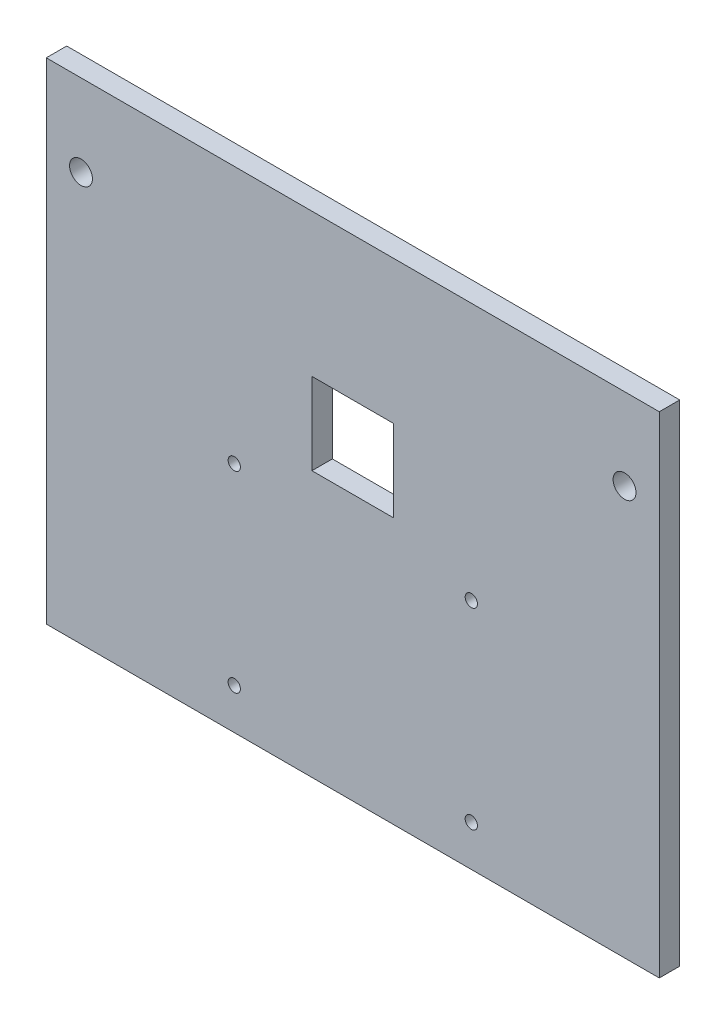
ISO-10303-21;
HEADER;
FILE_DESCRIPTION(('STEP AP214'),'2;1');
FILE_NAME('part.step','',(''),(''),'','','');
FILE_SCHEMA(('AUTOMOTIVE_DESIGN { 1 0 10303 214 1 1 1 1 }'));
ENDSEC;
DATA;
#1=APPLICATION_CONTEXT('core data for automotive mechanical design processes');
#2=APPLICATION_PROTOCOL_DEFINITION('international standard','automotive_design',2000,#1);
#3=PRODUCT_CONTEXT('',#1,'mechanical');
#4=PRODUCT('Part','Part','',(#3));
#5=PRODUCT_RELATED_PRODUCT_CATEGORY('part','',(#4));
#6=PRODUCT_DEFINITION_FORMATION('','',#4);
#7=PRODUCT_DEFINITION_CONTEXT('part definition',#1,'design');
#8=PRODUCT_DEFINITION('design','',#6,#7);
#9=PRODUCT_DEFINITION_SHAPE('','',#8);
#10=(LENGTH_UNIT() NAMED_UNIT(*) SI_UNIT(.MILLI.,.METRE.));
#11=(NAMED_UNIT(*) PLANE_ANGLE_UNIT() SI_UNIT($,.RADIAN.));
#12=(NAMED_UNIT(*) SI_UNIT($,.STERADIAN.) SOLID_ANGLE_UNIT());
#13=UNCERTAINTY_MEASURE_WITH_UNIT(LENGTH_MEASURE(1.E-05),#10,'distance_accuracy_value','');
#14=(GEOMETRIC_REPRESENTATION_CONTEXT(3) GLOBAL_UNCERTAINTY_ASSIGNED_CONTEXT((#13)) GLOBAL_UNIT_ASSIGNED_CONTEXT((#10,
#11,#12)) REPRESENTATION_CONTEXT('',''));
#15=CARTESIAN_POINT('',(0.,0.,0.));
#16=DIRECTION('',(0.,0.,1.));
#17=DIRECTION('',(1.,0.,0.));
#18=AXIS2_PLACEMENT_3D('',#15,#16,#17);
#19=CARTESIAN_POINT('',(0.,0.,5.));
#20=DIRECTION('',(0.,0.,1.));
#21=DIRECTION('',(1.,0.,0.));
#22=AXIS2_PLACEMENT_3D('',#19,#20,#21);
#23=PLANE('',#22);
#24=CARTESIAN_POINT('',(8.5,-20.,5.));
#25=DIRECTION('',(0.,0.,1.));
#26=DIRECTION('',(1.,0.,0.));
#27=AXIS2_PLACEMENT_3D('',#24,#25,#26);
#28=CIRCLE('',#27,2.8);
#29=CARTESIAN_POINT('',(11.3,-20.,5.));
#30=VERTEX_POINT('',#29);
#31=EDGE_CURVE('E285',#30,#30,#28,.T.);
#32=ORIENTED_EDGE('',*,*,#31,.F.);
#33=EDGE_LOOP('',(#32));
#34=FACE_BOUND('',#33,.T.);
#35=CARTESIAN_POINT('',(104.,-110.,5.));
#36=DIRECTION('',(0.,0.,1.));
#37=DIRECTION('',(1.,0.,0.));
#38=AXIS2_PLACEMENT_3D('',#35,#36,#37);
#39=CIRCLE('',#38,1.5);
#40=CARTESIAN_POINT('',(105.5,-110.,5.));
#41=VERTEX_POINT('',#40);
#42=EDGE_CURVE('E301',#41,#41,#39,.T.);
#43=ORIENTED_EDGE('',*,*,#42,.F.);
#44=EDGE_LOOP('',(#43));
#45=FACE_BOUND('',#44,.T.);
#46=CARTESIAN_POINT('',(46.,-63.,5.));
#47=DIRECTION('',(0.,0.,1.));
#48=DIRECTION('',(1.,0.,0.));
#49=AXIS2_PLACEMENT_3D('',#46,#47,#48);
#50=CIRCLE('',#49,1.5);
#51=CARTESIAN_POINT('',(47.5,-63.,5.));
#52=VERTEX_POINT('',#51);
#53=EDGE_CURVE('E140',#52,#52,#50,.T.);
#54=ORIENTED_EDGE('',*,*,#53,.F.);
#55=EDGE_LOOP('',(#54));
#56=FACE_BOUND('',#55,.T.);
#57=DIRECTION('',(0.,-1.,0.));
#58=VECTOR('',#57,1.);
#59=CARTESIAN_POINT('',(0.,0.,5.));
#60=LINE('',#59,#58);
#61=CARTESIAN_POINT('',(0.,0.,5.));
#62=VERTEX_POINT('',#61);
#63=CARTESIAN_POINT('',(0.,-120.,5.));
#64=VERTEX_POINT('',#63);
#65=EDGE_CURVE('E156',#62,#64,#60,.T.);
#66=ORIENTED_EDGE('',*,*,#65,.T.);
#67=DIRECTION('',(1.,0.,0.));
#68=VECTOR('',#67,1.);
#69=CARTESIAN_POINT('',(0.,-120.,5.));
#70=LINE('',#69,#68);
#71=CARTESIAN_POINT('',(150.,-120.,5.));
#72=VERTEX_POINT('',#71);
#73=EDGE_CURVE('E160',#64,#72,#70,.T.);
#74=ORIENTED_EDGE('',*,*,#73,.T.);
#75=DIRECTION('',(0.,1.,0.));
#76=VECTOR('',#75,1.);
#77=CARTESIAN_POINT('',(150.,0.,5.));
#78=LINE('',#77,#76);
#79=CARTESIAN_POINT('',(150.,0.,5.));
#80=VERTEX_POINT('',#79);
#81=EDGE_CURVE('E164',#72,#80,#78,.T.);
#82=ORIENTED_EDGE('',*,*,#81,.T.);
#83=DIRECTION('',(-1.,0.,0.));
#84=VECTOR('',#83,1.);
#85=CARTESIAN_POINT('',(0.,0.,5.));
#86=LINE('',#85,#84);
#87=EDGE_CURVE('E167',#80,#62,#86,.T.);
#88=ORIENTED_EDGE('',*,*,#87,.T.);
#89=EDGE_LOOP('',(#66,#74,#82,#88));
#90=FACE_BOUND('',#89,.T.);
#91=DIRECTION('',(1.,0.,0.));
#92=VECTOR('',#91,1.);
#93=CARTESIAN_POINT('',(65.,-55.,5.));
#94=LINE('',#93,#92);
#95=CARTESIAN_POINT('',(65.,-55.,5.));
#96=VERTEX_POINT('',#95);
#97=CARTESIAN_POINT('',(85.,-55.,5.));
#98=VERTEX_POINT('',#97);
#99=EDGE_CURVE('E114',#96,#98,#94,.T.);
#100=ORIENTED_EDGE('',*,*,#99,.F.);
#101=DIRECTION('',(0.,-1.,0.));
#102=VECTOR('',#101,1.);
#103=CARTESIAN_POINT('',(65.,-35.,5.));
#104=LINE('',#103,#102);
#105=CARTESIAN_POINT('',(65.,-35.,5.));
#106=VERTEX_POINT('',#105);
#107=EDGE_CURVE('E105',#106,#96,#104,.T.);
#108=ORIENTED_EDGE('',*,*,#107,.F.);
#109=DIRECTION('',(-1.,0.,0.));
#110=VECTOR('',#109,1.);
#111=CARTESIAN_POINT('',(65.,-35.,5.));
#112=LINE('',#111,#110);
#113=CARTESIAN_POINT('',(85.,-35.,5.));
#114=VERTEX_POINT('',#113);
#115=EDGE_CURVE('E132',#114,#106,#112,.T.);
#116=ORIENTED_EDGE('',*,*,#115,.F.);
#117=DIRECTION('',(0.,1.,0.));
#118=VECTOR('',#117,1.);
#119=CARTESIAN_POINT('',(85.,-35.,5.));
#120=LINE('',#119,#118);
#121=EDGE_CURVE('E128',#98,#114,#120,.T.);
#122=ORIENTED_EDGE('',*,*,#121,.F.);
#123=EDGE_LOOP('',(#100,#108,#116,#122));
#124=FACE_BOUND('',#123,.T.);
#125=CARTESIAN_POINT('',(104.,-63.,5.));
#126=DIRECTION('',(0.,0.,1.));
#127=DIRECTION('',(1.,0.,0.));
#128=AXIS2_PLACEMENT_3D('',#125,#126,#127);
#129=CIRCLE('',#128,1.5);
#130=CARTESIAN_POINT('',(105.5,-63.,5.));
#131=VERTEX_POINT('',#130);
#132=EDGE_CURVE('E309',#131,#131,#129,.T.);
#133=ORIENTED_EDGE('',*,*,#132,.F.);
#134=EDGE_LOOP('',(#133));
#135=FACE_BOUND('',#134,.T.);
#136=CARTESIAN_POINT('',(46.,-110.,5.));
#137=DIRECTION('',(0.,0.,1.));
#138=DIRECTION('',(1.,0.,0.));
#139=AXIS2_PLACEMENT_3D('',#136,#137,#138);
#140=CIRCLE('',#139,1.5);
#141=CARTESIAN_POINT('',(47.5,-110.,5.));
#142=VERTEX_POINT('',#141);
#143=EDGE_CURVE('E293',#142,#142,#140,.T.);
#144=ORIENTED_EDGE('',*,*,#143,.F.);
#145=EDGE_LOOP('',(#144));
#146=FACE_BOUND('',#145,.T.);
#147=CARTESIAN_POINT('',(141.5,-20.,5.));
#148=DIRECTION('',(0.,0.,1.));
#149=DIRECTION('',(1.,0.,0.));
#150=AXIS2_PLACEMENT_3D('',#147,#148,#149);
#151=CIRCLE('',#150,2.80000000000001);
#152=CARTESIAN_POINT('',(144.3,-20.,5.));
#153=VERTEX_POINT('',#152);
#154=EDGE_CURVE('E274',#153,#153,#151,.T.);
#155=ORIENTED_EDGE('',*,*,#154,.F.);
#156=EDGE_LOOP('',(#155));
#157=FACE_BOUND('',#156,.T.);
#158=ADVANCED_FACE('F39',(#34,#45,#56,#90,#124,#135,#146,#157),#23,.T.);
#159=CARTESIAN_POINT('',(0.,0.,0.));
#160=DIRECTION('',(0.,0.,1.));
#161=DIRECTION('',(1.,0.,0.));
#162=AXIS2_PLACEMENT_3D('',#159,#160,#161);
#163=PLANE('',#162);
#164=DIRECTION('',(0.,-1.,0.));
#165=VECTOR('',#164,1.);
#166=CARTESIAN_POINT('',(0.,0.,0.));
#167=LINE('',#166,#165);
#168=CARTESIAN_POINT('',(0.,0.,0.));
#169=VERTEX_POINT('',#168);
#170=CARTESIAN_POINT('',(0.,-120.,0.));
#171=VERTEX_POINT('',#170);
#172=EDGE_CURVE('E123',#169,#171,#167,.T.);
#173=ORIENTED_EDGE('',*,*,#172,.F.);
#174=DIRECTION('',(-1.,0.,0.));
#175=VECTOR('',#174,1.);
#176=CARTESIAN_POINT('',(0.,0.,0.));
#177=LINE('',#176,#175);
#178=CARTESIAN_POINT('',(150.,0.,0.));
#179=VERTEX_POINT('',#178);
#180=EDGE_CURVE('E161',#179,#169,#177,.T.);
#181=ORIENTED_EDGE('',*,*,#180,.F.);
#182=DIRECTION('',(0.,1.,0.));
#183=VECTOR('',#182,1.);
#184=CARTESIAN_POINT('',(150.,0.,0.));
#185=LINE('',#184,#183);
#186=CARTESIAN_POINT('',(150.,-120.,0.));
#187=VERTEX_POINT('',#186);
#188=EDGE_CURVE('E177',#187,#179,#185,.T.);
#189=ORIENTED_EDGE('',*,*,#188,.F.);
#190=DIRECTION('',(1.,0.,0.));
#191=VECTOR('',#190,1.);
#192=CARTESIAN_POINT('',(0.,-120.,0.));
#193=LINE('',#192,#191);
#194=EDGE_CURVE('E174',#171,#187,#193,.T.);
#195=ORIENTED_EDGE('',*,*,#194,.F.);
#196=EDGE_LOOP('',(#173,#181,#189,#195));
#197=FACE_BOUND('',#196,.T.);
#198=DIRECTION('',(0.,-1.,0.));
#199=VECTOR('',#198,1.);
#200=CARTESIAN_POINT('',(65.,-35.,0.));
#201=LINE('',#200,#199);
#202=CARTESIAN_POINT('',(65.,-35.,0.));
#203=VERTEX_POINT('',#202);
#204=CARTESIAN_POINT('',(65.,-55.,0.));
#205=VERTEX_POINT('',#204);
#206=EDGE_CURVE('E63',#203,#205,#201,.T.);
#207=ORIENTED_EDGE('',*,*,#206,.T.);
#208=DIRECTION('',(1.,0.,0.));
#209=VECTOR('',#208,1.);
#210=CARTESIAN_POINT('',(65.,-55.,0.));
#211=LINE('',#210,#209);
#212=CARTESIAN_POINT('',(85.,-55.,0.));
#213=VERTEX_POINT('',#212);
#214=EDGE_CURVE('E121',#205,#213,#211,.T.);
#215=ORIENTED_EDGE('',*,*,#214,.T.);
#216=DIRECTION('',(0.,1.,0.));
#217=VECTOR('',#216,1.);
#218=CARTESIAN_POINT('',(85.,-35.,0.));
#219=LINE('',#218,#217);
#220=CARTESIAN_POINT('',(85.,-35.,0.));
#221=VERTEX_POINT('',#220);
#222=EDGE_CURVE('E143',#213,#221,#219,.T.);
#223=ORIENTED_EDGE('',*,*,#222,.T.);
#224=DIRECTION('',(-1.,0.,0.));
#225=VECTOR('',#224,1.);
#226=CARTESIAN_POINT('',(65.,-35.,0.));
#227=LINE('',#226,#225);
#228=EDGE_CURVE('E115',#221,#203,#227,.T.);
#229=ORIENTED_EDGE('',*,*,#228,.T.);
#230=EDGE_LOOP('',(#207,#215,#223,#229));
#231=FACE_BOUND('',#230,.T.);
#232=CARTESIAN_POINT('',(46.,-63.,0.));
#233=DIRECTION('',(0.,0.,1.));
#234=DIRECTION('',(1.,0.,0.));
#235=AXIS2_PLACEMENT_3D('',#232,#233,#234);
#236=CIRCLE('',#235,1.5);
#237=CARTESIAN_POINT('',(47.5,-63.,0.));
#238=VERTEX_POINT('',#237);
#239=EDGE_CURVE('E313',#238,#238,#236,.T.);
#240=ORIENTED_EDGE('',*,*,#239,.T.);
#241=EDGE_LOOP('',(#240));
#242=FACE_BOUND('',#241,.T.);
#243=CARTESIAN_POINT('',(104.,-63.,0.));
#244=DIRECTION('',(0.,0.,1.));
#245=DIRECTION('',(1.,0.,0.));
#246=AXIS2_PLACEMENT_3D('',#243,#244,#245);
#247=CIRCLE('',#246,1.5);
#248=CARTESIAN_POINT('',(105.5,-63.,0.));
#249=VERTEX_POINT('',#248);
#250=EDGE_CURVE('E305',#249,#249,#247,.T.);
#251=ORIENTED_EDGE('',*,*,#250,.T.);
#252=EDGE_LOOP('',(#251));
#253=FACE_BOUND('',#252,.T.);
#254=CARTESIAN_POINT('',(104.,-110.,0.));
#255=DIRECTION('',(0.,0.,1.));
#256=DIRECTION('',(1.,0.,0.));
#257=AXIS2_PLACEMENT_3D('',#254,#255,#256);
#258=CIRCLE('',#257,1.5);
#259=CARTESIAN_POINT('',(105.5,-110.,0.));
#260=VERTEX_POINT('',#259);
#261=EDGE_CURVE('E297',#260,#260,#258,.T.);
#262=ORIENTED_EDGE('',*,*,#261,.T.);
#263=EDGE_LOOP('',(#262));
#264=FACE_BOUND('',#263,.T.);
#265=CARTESIAN_POINT('',(46.,-110.,0.));
#266=DIRECTION('',(0.,0.,1.));
#267=DIRECTION('',(1.,0.,0.));
#268=AXIS2_PLACEMENT_3D('',#265,#266,#267);
#269=CIRCLE('',#268,1.5);
#270=CARTESIAN_POINT('',(47.5,-110.,0.));
#271=VERTEX_POINT('',#270);
#272=EDGE_CURVE('E289',#271,#271,#269,.T.);
#273=ORIENTED_EDGE('',*,*,#272,.T.);
#274=EDGE_LOOP('',(#273));
#275=FACE_BOUND('',#274,.T.);
#276=CARTESIAN_POINT('',(8.5,-20.,0.));
#277=DIRECTION('',(0.,0.,1.));
#278=DIRECTION('',(1.,0.,0.));
#279=AXIS2_PLACEMENT_3D('',#276,#277,#278);
#280=CIRCLE('',#279,2.8);
#281=CARTESIAN_POINT('',(11.3,-20.,0.));
#282=VERTEX_POINT('',#281);
#283=EDGE_CURVE('E282',#282,#282,#280,.T.);
#284=ORIENTED_EDGE('',*,*,#283,.T.);
#285=EDGE_LOOP('',(#284));
#286=FACE_BOUND('',#285,.T.);
#287=CARTESIAN_POINT('',(141.5,-20.,0.));
#288=DIRECTION('',(0.,0.,1.));
#289=DIRECTION('',(1.,0.,0.));
#290=AXIS2_PLACEMENT_3D('',#287,#288,#289);
#291=CIRCLE('',#290,2.80000000000001);
#292=CARTESIAN_POINT('',(144.3,-20.,0.));
#293=VERTEX_POINT('',#292);
#294=EDGE_CURVE('E277',#293,#293,#291,.T.);
#295=ORIENTED_EDGE('',*,*,#294,.T.);
#296=EDGE_LOOP('',(#295));
#297=FACE_BOUND('',#296,.T.);
#298=ADVANCED_FACE('F200',(#197,#231,#242,#253,#264,#275,#286,#297),#163,.F.);
#299=CARTESIAN_POINT('',(0.,0.,5.));
#300=DIRECTION('',(1.,0.,0.));
#301=DIRECTION('',(0.,1.,0.));
#302=AXIS2_PLACEMENT_3D('',#299,#300,#301);
#303=PLANE('',#302);
#304=ORIENTED_EDGE('',*,*,#172,.T.);
#305=DIRECTION('',(0.,0.,-1.));
#306=VECTOR('',#305,1.);
#307=CARTESIAN_POINT('',(0.,-120.,5.));
#308=LINE('',#307,#306);
#309=EDGE_CURVE('E11',#64,#171,#308,.T.);
#310=ORIENTED_EDGE('',*,*,#309,.F.);
#311=ORIENTED_EDGE('',*,*,#65,.F.);
#312=DIRECTION('',(0.,0.,-1.));
#313=VECTOR('',#312,1.);
#314=CARTESIAN_POINT('',(0.,0.,5.));
#315=LINE('',#314,#313);
#316=EDGE_CURVE('E170',#62,#169,#315,.T.);
#317=ORIENTED_EDGE('',*,*,#316,.T.);
#318=EDGE_LOOP('',(#304,#310,#311,#317));
#319=FACE_BOUND('',#318,.T.);
#320=ADVANCED_FACE('F41',(#319),#303,.F.);
#321=CARTESIAN_POINT('',(0.,-120.,5.));
#322=DIRECTION('',(0.,1.,0.));
#323=DIRECTION('',(0.,0.,1.));
#324=AXIS2_PLACEMENT_3D('',#321,#322,#323);
#325=PLANE('',#324);
#326=ORIENTED_EDGE('',*,*,#194,.T.);
#327=DIRECTION('',(0.,0.,-1.));
#328=VECTOR('',#327,1.);
#329=CARTESIAN_POINT('',(150.,-120.,5.));
#330=LINE('',#329,#328);
#331=EDGE_CURVE('E48',#72,#187,#330,.T.);
#332=ORIENTED_EDGE('',*,*,#331,.F.);
#333=ORIENTED_EDGE('',*,*,#73,.F.);
#334=ORIENTED_EDGE('',*,*,#309,.T.);
#335=EDGE_LOOP('',(#326,#332,#333,#334));
#336=FACE_BOUND('',#335,.T.);
#337=ADVANCED_FACE('F210',(#336),#325,.F.);
#338=CARTESIAN_POINT('',(150.,0.,5.));
#339=DIRECTION('',(-1.,0.,0.));
#340=DIRECTION('',(0.,-1.,0.));
#341=AXIS2_PLACEMENT_3D('',#338,#339,#340);
#342=PLANE('',#341);
#343=ORIENTED_EDGE('',*,*,#188,.T.);
#344=DIRECTION('',(0.,0.,-1.));
#345=VECTOR('',#344,1.);
#346=CARTESIAN_POINT('',(150.,0.,5.));
#347=LINE('',#346,#345);
#348=EDGE_CURVE('E185',#80,#179,#347,.T.);
#349=ORIENTED_EDGE('',*,*,#348,.F.);
#350=ORIENTED_EDGE('',*,*,#81,.F.);
#351=ORIENTED_EDGE('',*,*,#331,.T.);
#352=EDGE_LOOP('',(#343,#349,#350,#351));
#353=FACE_BOUND('',#352,.T.);
#354=ADVANCED_FACE('F194',(#353),#342,.F.);
#355=CARTESIAN_POINT('',(0.,0.,5.));
#356=DIRECTION('',(0.,-1.,0.));
#357=DIRECTION('',(0.,0.,-1.));
#358=AXIS2_PLACEMENT_3D('',#355,#356,#357);
#359=PLANE('',#358);
#360=ORIENTED_EDGE('',*,*,#180,.T.);
#361=ORIENTED_EDGE('',*,*,#316,.F.);
#362=ORIENTED_EDGE('',*,*,#87,.F.);
#363=ORIENTED_EDGE('',*,*,#348,.T.);
#364=EDGE_LOOP('',(#360,#361,#362,#363));
#365=FACE_BOUND('',#364,.T.);
#366=ADVANCED_FACE('F204',(#365),#359,.F.);
#367=CARTESIAN_POINT('',(65.,-35.,5.));
#368=DIRECTION('',(1.,0.,0.));
#369=DIRECTION('',(0.,0.,-1.));
#370=AXIS2_PLACEMENT_3D('',#367,#368,#369);
#371=PLANE('',#370);
#372=ORIENTED_EDGE('',*,*,#206,.F.);
#373=DIRECTION('',(0.,0.,-1.));
#374=VECTOR('',#373,1.);
#375=CARTESIAN_POINT('',(65.,-35.,5.));
#376=LINE('',#375,#374);
#377=EDGE_CURVE('E109',#106,#203,#376,.T.);
#378=ORIENTED_EDGE('',*,*,#377,.F.);
#379=ORIENTED_EDGE('',*,*,#107,.T.);
#380=DIRECTION('',(0.,0.,-1.));
#381=VECTOR('',#380,1.);
#382=CARTESIAN_POINT('',(65.,-55.,5.));
#383=LINE('',#382,#381);
#384=EDGE_CURVE('E108',#96,#205,#383,.T.);
#385=ORIENTED_EDGE('',*,*,#384,.T.);
#386=EDGE_LOOP('',(#372,#378,#379,#385));
#387=FACE_BOUND('',#386,.T.);
#388=ADVANCED_FACE('F107',(#387),#371,.T.);
#389=CARTESIAN_POINT('',(65.,-55.,5.));
#390=DIRECTION('',(0.,1.,0.));
#391=DIRECTION('',(-1.,0.,0.));
#392=AXIS2_PLACEMENT_3D('',#389,#390,#391);
#393=PLANE('',#392);
#394=ORIENTED_EDGE('',*,*,#214,.F.);
#395=ORIENTED_EDGE('',*,*,#384,.F.);
#396=ORIENTED_EDGE('',*,*,#99,.T.);
#397=DIRECTION('',(0.,0.,-1.));
#398=VECTOR('',#397,1.);
#399=CARTESIAN_POINT('',(85.,-55.,5.));
#400=LINE('',#399,#398);
#401=EDGE_CURVE('E124',#98,#213,#400,.T.);
#402=ORIENTED_EDGE('',*,*,#401,.T.);
#403=EDGE_LOOP('',(#394,#395,#396,#402));
#404=FACE_BOUND('',#403,.T.);
#405=ADVANCED_FACE('F118',(#404),#393,.T.);
#406=CARTESIAN_POINT('',(85.,-35.,5.));
#407=DIRECTION('',(-1.,0.,0.));
#408=DIRECTION('',(0.,0.,1.));
#409=AXIS2_PLACEMENT_3D('',#406,#407,#408);
#410=PLANE('',#409);
#411=ORIENTED_EDGE('',*,*,#222,.F.);
#412=ORIENTED_EDGE('',*,*,#401,.F.);
#413=ORIENTED_EDGE('',*,*,#121,.T.);
#414=DIRECTION('',(0.,0.,-1.));
#415=VECTOR('',#414,1.);
#416=CARTESIAN_POINT('',(85.,-35.,5.));
#417=LINE('',#416,#415);
#418=EDGE_CURVE('E55',#114,#221,#417,.T.);
#419=ORIENTED_EDGE('',*,*,#418,.T.);
#420=EDGE_LOOP('',(#411,#412,#413,#419));
#421=FACE_BOUND('',#420,.T.);
#422=ADVANCED_FACE('F236',(#421),#410,.T.);
#423=CARTESIAN_POINT('',(65.,-35.,5.));
#424=DIRECTION('',(0.,-1.,0.));
#425=DIRECTION('',(0.,0.,-1.));
#426=AXIS2_PLACEMENT_3D('',#423,#424,#425);
#427=PLANE('',#426);
#428=ORIENTED_EDGE('',*,*,#228,.F.);
#429=ORIENTED_EDGE('',*,*,#418,.F.);
#430=ORIENTED_EDGE('',*,*,#115,.T.);
#431=ORIENTED_EDGE('',*,*,#377,.T.);
#432=EDGE_LOOP('',(#428,#429,#430,#431));
#433=FACE_BOUND('',#432,.T.);
#434=ADVANCED_FACE('F240',(#433),#427,.T.);
#435=CARTESIAN_POINT('',(46.,-63.,5.));
#436=DIRECTION('',(0.,0.,-1.));
#437=DIRECTION('',(-1.,0.,0.));
#438=AXIS2_PLACEMENT_3D('',#435,#436,#437);
#439=CYLINDRICAL_SURFACE('',#438,1.5);
#440=ORIENTED_EDGE('',*,*,#53,.T.);
#441=EDGE_LOOP('',(#440));
#442=FACE_BOUND('',#441,.T.);
#443=ORIENTED_EDGE('',*,*,#239,.F.);
#444=EDGE_LOOP('',(#443));
#445=FACE_BOUND('',#444,.T.);
#446=ADVANCED_FACE('F246',(#442,#445),#439,.F.);
#447=CARTESIAN_POINT('',(104.,-63.,5.));
#448=DIRECTION('',(0.,0.,-1.));
#449=DIRECTION('',(-1.,0.,0.));
#450=AXIS2_PLACEMENT_3D('',#447,#448,#449);
#451=CYLINDRICAL_SURFACE('',#450,1.5);
#452=ORIENTED_EDGE('',*,*,#132,.T.);
#453=EDGE_LOOP('',(#452));
#454=FACE_BOUND('',#453,.T.);
#455=ORIENTED_EDGE('',*,*,#250,.F.);
#456=EDGE_LOOP('',(#455));
#457=FACE_BOUND('',#456,.T.);
#458=ADVANCED_FACE('F249',(#454,#457),#451,.F.);
#459=CARTESIAN_POINT('',(104.,-110.,5.));
#460=DIRECTION('',(0.,0.,-1.));
#461=DIRECTION('',(-1.,0.,0.));
#462=AXIS2_PLACEMENT_3D('',#459,#460,#461);
#463=CYLINDRICAL_SURFACE('',#462,1.5);
#464=ORIENTED_EDGE('',*,*,#42,.T.);
#465=EDGE_LOOP('',(#464));
#466=FACE_BOUND('',#465,.T.);
#467=ORIENTED_EDGE('',*,*,#261,.F.);
#468=EDGE_LOOP('',(#467));
#469=FACE_BOUND('',#468,.T.);
#470=ADVANCED_FACE('F253',(#466,#469),#463,.F.);
#471=CARTESIAN_POINT('',(46.,-110.,5.));
#472=DIRECTION('',(0.,0.,-1.));
#473=DIRECTION('',(-1.,0.,0.));
#474=AXIS2_PLACEMENT_3D('',#471,#472,#473);
#475=CYLINDRICAL_SURFACE('',#474,1.5);
#476=ORIENTED_EDGE('',*,*,#143,.T.);
#477=EDGE_LOOP('',(#476));
#478=FACE_BOUND('',#477,.T.);
#479=ORIENTED_EDGE('',*,*,#272,.F.);
#480=EDGE_LOOP('',(#479));
#481=FACE_BOUND('',#480,.T.);
#482=ADVANCED_FACE('F257',(#478,#481),#475,.F.);
#483=CARTESIAN_POINT('',(8.5,-20.,5.));
#484=DIRECTION('',(0.,0.,-1.));
#485=DIRECTION('',(-1.,0.,0.));
#486=AXIS2_PLACEMENT_3D('',#483,#484,#485);
#487=CYLINDRICAL_SURFACE('',#486,2.8);
#488=ORIENTED_EDGE('',*,*,#31,.T.);
#489=EDGE_LOOP('',(#488));
#490=FACE_BOUND('',#489,.T.);
#491=ORIENTED_EDGE('',*,*,#283,.F.);
#492=EDGE_LOOP('',(#491));
#493=FACE_BOUND('',#492,.T.);
#494=ADVANCED_FACE('F261',(#490,#493),#487,.F.);
#495=CARTESIAN_POINT('',(141.5,-20.,5.));
#496=DIRECTION('',(0.,0.,-1.));
#497=DIRECTION('',(-1.,0.,0.));
#498=AXIS2_PLACEMENT_3D('',#495,#496,#497);
#499=CYLINDRICAL_SURFACE('',#498,2.80000000000001);
#500=ORIENTED_EDGE('',*,*,#154,.T.);
#501=EDGE_LOOP('',(#500));
#502=FACE_BOUND('',#501,.T.);
#503=ORIENTED_EDGE('',*,*,#294,.F.);
#504=EDGE_LOOP('',(#503));
#505=FACE_BOUND('',#504,.T.);
#506=ADVANCED_FACE('F265',(#502,#505),#499,.F.);
#507=CLOSED_SHELL('',(#158,#298,#320,#337,#354,#366,#388,#405,#422,#434,#446,#458,#470,#482,
#494,#506));
#508=MANIFOLD_SOLID_BREP('B2',#507);
#509=ADVANCED_BREP_SHAPE_REPRESENTATION('',(#18,#508),#14);
#510=SHAPE_DEFINITION_REPRESENTATION(#9,#509);
ENDSEC;
END-ISO-10303-21;
